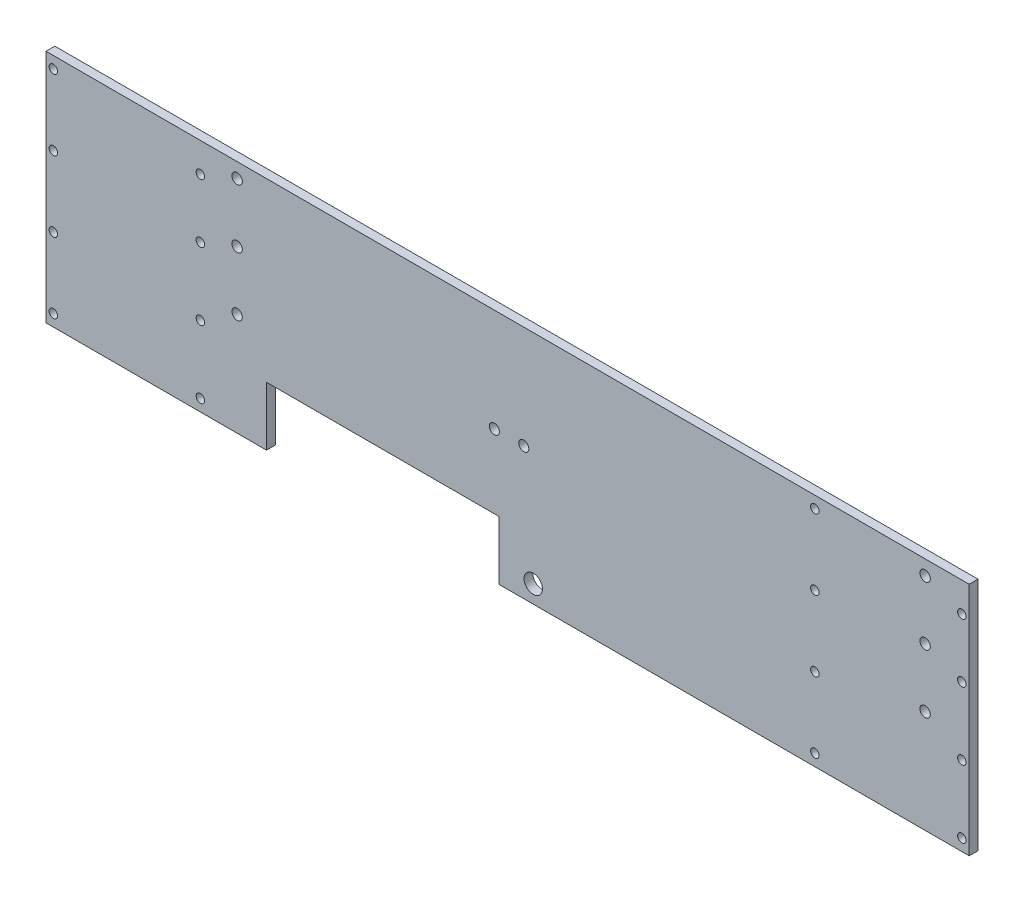
ISO-10303-21;
HEADER;
FILE_DESCRIPTION(('STEP AP214'),'2;1');
FILE_NAME('part.step','',(''),(''),'','','');
FILE_SCHEMA(('AUTOMOTIVE_DESIGN { 1 0 10303 214 1 1 1 1 }'));
ENDSEC;
DATA;
#1=APPLICATION_CONTEXT('core data for automotive mechanical design processes');
#2=APPLICATION_PROTOCOL_DEFINITION('international standard','automotive_design',2000,#1);
#3=PRODUCT_CONTEXT('',#1,'mechanical');
#4=PRODUCT('Part','Part','',(#3));
#5=PRODUCT_RELATED_PRODUCT_CATEGORY('part','',(#4));
#6=PRODUCT_DEFINITION_FORMATION('','',#4);
#7=PRODUCT_DEFINITION_CONTEXT('part definition',#1,'design');
#8=PRODUCT_DEFINITION('design','',#6,#7);
#9=PRODUCT_DEFINITION_SHAPE('','',#8);
#10=(LENGTH_UNIT() NAMED_UNIT(*) SI_UNIT(.MILLI.,.METRE.));
#11=(NAMED_UNIT(*) PLANE_ANGLE_UNIT() SI_UNIT($,.RADIAN.));
#12=(NAMED_UNIT(*) SI_UNIT($,.STERADIAN.) SOLID_ANGLE_UNIT());
#13=UNCERTAINTY_MEASURE_WITH_UNIT(LENGTH_MEASURE(1.E-05),#10,'distance_accuracy_value','');
#14=(GEOMETRIC_REPRESENTATION_CONTEXT(3) GLOBAL_UNCERTAINTY_ASSIGNED_CONTEXT((#13)) GLOBAL_UNIT_ASSIGNED_CONTEXT((#10,
#11,#12)) REPRESENTATION_CONTEXT('',''));
#15=CARTESIAN_POINT('',(0.,0.,0.));
#16=DIRECTION('',(0.,0.,1.));
#17=DIRECTION('',(1.,0.,0.));
#18=AXIS2_PLACEMENT_3D('',#15,#16,#17);
#19=CARTESIAN_POINT('',(-199.39,-50.8,3.81));
#20=DIRECTION('',(0.,1.,0.));
#21=DIRECTION('',(0.,0.,1.));
#22=AXIS2_PLACEMENT_3D('',#19,#20,#21);
#23=PLANE('',#22);
#24=DIRECTION('',(1.,0.,0.));
#25=VECTOR('',#24,1.);
#26=CARTESIAN_POINT('',(-199.39,-50.8,0.));
#27=LINE('',#26,#25);
#28=CARTESIAN_POINT('',(-199.39,-50.8,0.));
#29=VERTEX_POINT('',#28);
#30=CARTESIAN_POINT('',(-104.14,-50.8,0.));
#31=VERTEX_POINT('',#30);
#32=EDGE_CURVE('E129',#29,#31,#27,.T.);
#33=ORIENTED_EDGE('',*,*,#32,.T.);
#34=DIRECTION('',(0.,0.,1.));
#35=VECTOR('',#34,1.);
#36=CARTESIAN_POINT('',(-104.14,-50.8,0.));
#37=LINE('',#36,#35);
#38=CARTESIAN_POINT('',(-104.14,-50.8,3.81));
#39=VERTEX_POINT('',#38);
#40=EDGE_CURVE('E113',#31,#39,#37,.T.);
#41=ORIENTED_EDGE('',*,*,#40,.T.);
#42=DIRECTION('',(1.,0.,0.));
#43=VECTOR('',#42,1.);
#44=CARTESIAN_POINT('',(-199.39,-50.8,3.81));
#45=LINE('',#44,#43);
#46=CARTESIAN_POINT('',(-199.39,-50.8,3.81));
#47=VERTEX_POINT('',#46);
#48=EDGE_CURVE('E146',#47,#39,#45,.T.);
#49=ORIENTED_EDGE('',*,*,#48,.F.);
#50=DIRECTION('',(0.,0.,-1.));
#51=VECTOR('',#50,1.);
#52=CARTESIAN_POINT('',(-199.39,-50.8,3.81));
#53=LINE('',#52,#51);
#54=EDGE_CURVE('E136',#47,#29,#53,.T.);
#55=ORIENTED_EDGE('',*,*,#54,.T.);
#56=EDGE_LOOP('',(#33,#41,#49,#55));
#57=FACE_BOUND('',#56,.T.);
#58=ADVANCED_FACE('F37',(#57),#23,.F.);
#59=CARTESIAN_POINT('',(199.39,50.8,3.81));
#60=DIRECTION('',(-1.,0.,0.));
#61=DIRECTION('',(0.,0.,1.));
#62=AXIS2_PLACEMENT_3D('',#59,#60,#61);
#63=PLANE('',#62);
#64=DIRECTION('',(0.,1.,0.));
#65=VECTOR('',#64,1.);
#66=CARTESIAN_POINT('',(199.39,50.8,0.));
#67=LINE('',#66,#65);
#68=CARTESIAN_POINT('',(199.39,-50.8,0.));
#69=VERTEX_POINT('',#68);
#70=CARTESIAN_POINT('',(199.39,50.8,0.));
#71=VERTEX_POINT('',#70);
#72=EDGE_CURVE('E155',#69,#71,#67,.T.);
#73=ORIENTED_EDGE('',*,*,#72,.T.);
#74=DIRECTION('',(0.,0.,-1.));
#75=VECTOR('',#74,1.);
#76=CARTESIAN_POINT('',(199.39,50.8,3.81));
#77=LINE('',#76,#75);
#78=CARTESIAN_POINT('',(199.39,50.8,3.81));
#79=VERTEX_POINT('',#78);
#80=EDGE_CURVE('E11',#79,#71,#77,.T.);
#81=ORIENTED_EDGE('',*,*,#80,.F.);
#82=DIRECTION('',(0.,1.,0.));
#83=VECTOR('',#82,1.);
#84=CARTESIAN_POINT('',(199.39,50.8,3.81));
#85=LINE('',#84,#83);
#86=CARTESIAN_POINT('',(199.39,-50.8,3.81));
#87=VERTEX_POINT('',#86);
#88=EDGE_CURVE('E137',#87,#79,#85,.T.);
#89=ORIENTED_EDGE('',*,*,#88,.F.);
#90=DIRECTION('',(0.,0.,-1.));
#91=VECTOR('',#90,1.);
#92=CARTESIAN_POINT('',(199.39,-50.8,3.81));
#93=LINE('',#92,#91);
#94=EDGE_CURVE('E144',#87,#69,#93,.T.);
#95=ORIENTED_EDGE('',*,*,#94,.T.);
#96=EDGE_LOOP('',(#73,#81,#89,#95));
#97=FACE_BOUND('',#96,.T.);
#98=ADVANCED_FACE('F39',(#97),#63,.F.);
#99=CARTESIAN_POINT('',(-199.39,50.8,3.81));
#100=DIRECTION('',(0.,-1.,0.));
#101=DIRECTION('',(0.,0.,-1.));
#102=AXIS2_PLACEMENT_3D('',#99,#100,#101);
#103=PLANE('',#102);
#104=DIRECTION('',(-1.,0.,0.));
#105=VECTOR('',#104,1.);
#106=CARTESIAN_POINT('',(-199.39,50.8,0.));
#107=LINE('',#106,#105);
#108=CARTESIAN_POINT('',(-199.39,50.8,0.));
#109=VERTEX_POINT('',#108);
#110=EDGE_CURVE('E154',#71,#109,#107,.T.);
#111=ORIENTED_EDGE('',*,*,#110,.T.);
#112=DIRECTION('',(0.,0.,-1.));
#113=VECTOR('',#112,1.);
#114=CARTESIAN_POINT('',(-199.39,50.8,3.81));
#115=LINE('',#114,#113);
#116=CARTESIAN_POINT('',(-199.39,50.8,3.81));
#117=VERTEX_POINT('',#116);
#118=EDGE_CURVE('E46',#117,#109,#115,.T.);
#119=ORIENTED_EDGE('',*,*,#118,.F.);
#120=DIRECTION('',(-1.,0.,0.));
#121=VECTOR('',#120,1.);
#122=CARTESIAN_POINT('',(-199.39,50.8,3.81));
#123=LINE('',#122,#121);
#124=EDGE_CURVE('E91',#79,#117,#123,.T.);
#125=ORIENTED_EDGE('',*,*,#124,.F.);
#126=ORIENTED_EDGE('',*,*,#80,.T.);
#127=EDGE_LOOP('',(#111,#119,#125,#126));
#128=FACE_BOUND('',#127,.T.);
#129=ADVANCED_FACE('F344',(#128),#103,.F.);
#130=CARTESIAN_POINT('',(-199.39,50.8,3.81));
#131=DIRECTION('',(1.,0.,0.));
#132=DIRECTION('',(0.,0.,-1.));
#133=AXIS2_PLACEMENT_3D('',#130,#131,#132);
#134=PLANE('',#133);
#135=DIRECTION('',(0.,-1.,0.));
#136=VECTOR('',#135,1.);
#137=CARTESIAN_POINT('',(-199.39,50.8,0.));
#138=LINE('',#137,#136);
#139=EDGE_CURVE('E140',#109,#29,#138,.T.);
#140=ORIENTED_EDGE('',*,*,#139,.T.);
#141=ORIENTED_EDGE('',*,*,#54,.F.);
#142=DIRECTION('',(0.,-1.,0.));
#143=VECTOR('',#142,1.);
#144=CARTESIAN_POINT('',(-199.39,50.8,3.81));
#145=LINE('',#144,#143);
#146=EDGE_CURVE('E152',#117,#47,#145,.T.);
#147=ORIENTED_EDGE('',*,*,#146,.F.);
#148=ORIENTED_EDGE('',*,*,#118,.T.);
#149=EDGE_LOOP('',(#140,#141,#147,#148));
#150=FACE_BOUND('',#149,.T.);
#151=ADVANCED_FACE('F151',(#150),#134,.F.);
#152=CARTESIAN_POINT('',(-3.80999999999998,-50.8,3.81));
#153=VERTEX_POINT('',#152);
#154=EDGE_CURVE('E62',#153,#87,#45,.T.);
#155=ORIENTED_EDGE('',*,*,#154,.F.);
#156=DIRECTION('',(0.,0.,1.));
#157=VECTOR('',#156,1.);
#158=CARTESIAN_POINT('',(-3.80999999999998,-50.8,0.));
#159=LINE('',#158,#157);
#160=CARTESIAN_POINT('',(-3.80999999999998,-50.8,0.));
#161=VERTEX_POINT('',#160);
#162=EDGE_CURVE('E123',#161,#153,#159,.T.);
#163=ORIENTED_EDGE('',*,*,#162,.F.);
#164=EDGE_CURVE('E84',#161,#69,#27,.T.);
#165=ORIENTED_EDGE('',*,*,#164,.T.);
#166=ORIENTED_EDGE('',*,*,#94,.F.);
#167=EDGE_LOOP('',(#155,#163,#165,#166));
#168=FACE_BOUND('',#167,.T.);
#169=ADVANCED_FACE('F340',(#168),#23,.F.);
#170=CARTESIAN_POINT('',(0.,0.,3.81));
#171=DIRECTION('',(0.,0.,1.));
#172=DIRECTION('',(1.,0.,0.));
#173=AXIS2_PLACEMENT_3D('',#170,#171,#172);
#174=PLANE('',#173);
#175=CARTESIAN_POINT('',(-5.71499999999997,6.35,3.81));
#176=DIRECTION('',(0.,0.,1.));
#177=DIRECTION('',(1.,0.,0.));
#178=AXIS2_PLACEMENT_3D('',#175,#176,#177);
#179=CIRCLE('',#178,2.182876);
#180=CARTESIAN_POINT('',(-3.53212399999997,6.35,3.81));
#181=VERTEX_POINT('',#180);
#182=EDGE_CURVE('E319',#181,#181,#179,.T.);
#183=ORIENTED_EDGE('',*,*,#182,.F.);
#184=EDGE_LOOP('',(#183));
#185=FACE_BOUND('',#184,.T.);
#186=CARTESIAN_POINT('',(6.98500000000005,6.35000000000001,3.81));
#187=DIRECTION('',(0.,0.,1.));
#188=DIRECTION('',(1.,0.,0.));
#189=AXIS2_PLACEMENT_3D('',#186,#187,#188);
#190=CIRCLE('',#189,2.182876);
#191=CARTESIAN_POINT('',(9.16787600000005,6.35000000000001,3.81));
#192=VERTEX_POINT('',#191);
#193=EDGE_CURVE('E316',#192,#192,#190,.T.);
#194=ORIENTED_EDGE('',*,*,#193,.F.);
#195=EDGE_LOOP('',(#194));
#196=FACE_BOUND('',#195,.T.);
#197=CARTESIAN_POINT('',(-132.715,-16.51,3.81));
#198=DIRECTION('',(0.,0.,1.));
#199=DIRECTION('',(1.,0.,0.));
#200=AXIS2_PLACEMENT_3D('',#197,#198,#199);
#201=CIRCLE('',#200,1.82879999999999);
#202=CARTESIAN_POINT('',(-130.8862,-16.51,3.81));
#203=VERTEX_POINT('',#202);
#204=EDGE_CURVE('E307',#203,#203,#201,.T.);
#205=ORIENTED_EDGE('',*,*,#204,.F.);
#206=EDGE_LOOP('',(#205));
#207=FACE_BOUND('',#206,.T.);
#208=CARTESIAN_POINT('',(-132.715,12.7,3.81));
#209=DIRECTION('',(0.,0.,1.));
#210=DIRECTION('',(1.,0.,0.));
#211=AXIS2_PLACEMENT_3D('',#208,#209,#210);
#212=CIRCLE('',#211,1.82879999999999);
#213=CARTESIAN_POINT('',(-130.8862,12.7,3.81));
#214=VERTEX_POINT('',#213);
#215=EDGE_CURVE('E301',#214,#214,#212,.T.);
#216=ORIENTED_EDGE('',*,*,#215,.F.);
#217=EDGE_LOOP('',(#216));
#218=FACE_BOUND('',#217,.T.);
#219=CARTESIAN_POINT('',(-132.715,38.1,3.81));
#220=DIRECTION('',(0.,0.,1.));
#221=DIRECTION('',(1.,0.,0.));
#222=AXIS2_PLACEMENT_3D('',#219,#220,#221);
#223=CIRCLE('',#222,1.82879999999999);
#224=CARTESIAN_POINT('',(-130.8862,38.1,3.81));
#225=VERTEX_POINT('',#224);
#226=EDGE_CURVE('E295',#225,#225,#223,.T.);
#227=ORIENTED_EDGE('',*,*,#226,.F.);
#228=EDGE_LOOP('',(#227));
#229=FACE_BOUND('',#228,.T.);
#230=CARTESIAN_POINT('',(-196.215,45.72,3.81));
#231=DIRECTION('',(0.,0.,1.));
#232=DIRECTION('',(1.,0.,0.));
#233=AXIS2_PLACEMENT_3D('',#230,#231,#232);
#234=CIRCLE('',#233,1.82879999999999);
#235=CARTESIAN_POINT('',(-194.3862,45.72,3.81));
#236=VERTEX_POINT('',#235);
#237=EDGE_CURVE('E289',#236,#236,#234,.T.);
#238=ORIENTED_EDGE('',*,*,#237,.F.);
#239=EDGE_LOOP('',(#238));
#240=FACE_BOUND('',#239,.T.);
#241=CARTESIAN_POINT('',(-196.215,15.24,3.81));
#242=DIRECTION('',(0.,0.,1.));
#243=DIRECTION('',(1.,0.,0.));
#244=AXIS2_PLACEMENT_3D('',#241,#242,#243);
#245=CIRCLE('',#244,1.82879999999999);
#246=CARTESIAN_POINT('',(-194.3862,15.24,3.81));
#247=VERTEX_POINT('',#246);
#248=EDGE_CURVE('E283',#247,#247,#245,.T.);
#249=ORIENTED_EDGE('',*,*,#248,.F.);
#250=EDGE_LOOP('',(#249));
#251=FACE_BOUND('',#250,.T.);
#252=CARTESIAN_POINT('',(-196.215,-45.72,3.81));
#253=DIRECTION('',(0.,0.,1.));
#254=DIRECTION('',(1.,0.,0.));
#255=AXIS2_PLACEMENT_3D('',#252,#253,#254);
#256=CIRCLE('',#255,1.82879999999999);
#257=CARTESIAN_POINT('',(-194.3862,-45.72,3.81));
#258=VERTEX_POINT('',#257);
#259=EDGE_CURVE('E277',#258,#258,#256,.T.);
#260=ORIENTED_EDGE('',*,*,#259,.F.);
#261=EDGE_LOOP('',(#260));
#262=FACE_BOUND('',#261,.T.);
#263=CARTESIAN_POINT('',(-132.715,-45.72,3.81));
#264=DIRECTION('',(0.,0.,1.));
#265=DIRECTION('',(1.,0.,0.));
#266=AXIS2_PLACEMENT_3D('',#263,#264,#265);
#267=CIRCLE('',#266,1.82879999999999);
#268=CARTESIAN_POINT('',(-130.8862,-45.72,3.81));
#269=VERTEX_POINT('',#268);
#270=EDGE_CURVE('E271',#269,#269,#267,.T.);
#271=ORIENTED_EDGE('',*,*,#270,.F.);
#272=EDGE_LOOP('',(#271));
#273=FACE_BOUND('',#272,.T.);
#274=CARTESIAN_POINT('',(-196.215,-15.24,3.81));
#275=DIRECTION('',(0.,0.,1.));
#276=DIRECTION('',(1.,0.,0.));
#277=AXIS2_PLACEMENT_3D('',#274,#275,#276);
#278=CIRCLE('',#277,1.82879999999999);
#279=CARTESIAN_POINT('',(-194.3862,-15.24,3.81));
#280=VERTEX_POINT('',#279);
#281=EDGE_CURVE('E265',#280,#280,#278,.T.);
#282=ORIENTED_EDGE('',*,*,#281,.F.);
#283=EDGE_LOOP('',(#282));
#284=FACE_BOUND('',#283,.T.);
#285=CARTESIAN_POINT('',(180.34,44.45,3.81));
#286=DIRECTION('',(0.,0.,1.));
#287=DIRECTION('',(1.,0.,0.));
#288=AXIS2_PLACEMENT_3D('',#285,#286,#287);
#289=CIRCLE('',#288,2.2479);
#290=CARTESIAN_POINT('',(182.5879,44.45,3.81));
#291=VERTEX_POINT('',#290);
#292=EDGE_CURVE('E262',#291,#291,#289,.T.);
#293=ORIENTED_EDGE('',*,*,#292,.F.);
#294=EDGE_LOOP('',(#293));
#295=FACE_BOUND('',#294,.T.);
#296=CARTESIAN_POINT('',(180.34,19.05,3.81));
#297=DIRECTION('',(0.,0.,1.));
#298=DIRECTION('',(1.,0.,0.));
#299=AXIS2_PLACEMENT_3D('',#296,#297,#298);
#300=CIRCLE('',#299,2.2479);
#301=CARTESIAN_POINT('',(182.5879,19.05,3.81));
#302=VERTEX_POINT('',#301);
#303=EDGE_CURVE('E256',#302,#302,#300,.T.);
#304=ORIENTED_EDGE('',*,*,#303,.F.);
#305=EDGE_LOOP('',(#304));
#306=FACE_BOUND('',#305,.T.);
#307=CARTESIAN_POINT('',(180.34,-6.35,3.81));
#308=DIRECTION('',(0.,0.,1.));
#309=DIRECTION('',(1.,0.,0.));
#310=AXIS2_PLACEMENT_3D('',#307,#308,#309);
#311=CIRCLE('',#310,2.2479);
#312=CARTESIAN_POINT('',(182.5879,-6.35,3.81));
#313=VERTEX_POINT('',#312);
#314=EDGE_CURVE('E250',#313,#313,#311,.T.);
#315=ORIENTED_EDGE('',*,*,#314,.F.);
#316=EDGE_LOOP('',(#315));
#317=FACE_BOUND('',#316,.T.);
#318=CARTESIAN_POINT('',(-116.84,44.45,3.81));
#319=DIRECTION('',(0.,0.,1.));
#320=DIRECTION('',(1.,0.,0.));
#321=AXIS2_PLACEMENT_3D('',#318,#319,#320);
#322=CIRCLE('',#321,2.2479);
#323=CARTESIAN_POINT('',(-114.5921,44.45,3.81));
#324=VERTEX_POINT('',#323);
#325=EDGE_CURVE('E244',#324,#324,#322,.T.);
#326=ORIENTED_EDGE('',*,*,#325,.F.);
#327=EDGE_LOOP('',(#326));
#328=FACE_BOUND('',#327,.T.);
#329=CARTESIAN_POINT('',(-116.84,19.05,3.81));
#330=DIRECTION('',(0.,0.,1.));
#331=DIRECTION('',(1.,0.,0.));
#332=AXIS2_PLACEMENT_3D('',#329,#330,#331);
#333=CIRCLE('',#332,2.2479);
#334=CARTESIAN_POINT('',(-114.5921,19.05,3.81));
#335=VERTEX_POINT('',#334);
#336=EDGE_CURVE('E238',#335,#335,#333,.T.);
#337=ORIENTED_EDGE('',*,*,#336,.F.);
#338=EDGE_LOOP('',(#337));
#339=FACE_BOUND('',#338,.T.);
#340=CARTESIAN_POINT('',(-116.84,-6.35,3.81));
#341=DIRECTION('',(0.,0.,1.));
#342=DIRECTION('',(1.,0.,0.));
#343=AXIS2_PLACEMENT_3D('',#340,#341,#342);
#344=CIRCLE('',#343,2.2479);
#345=CARTESIAN_POINT('',(-114.5921,-6.35,3.81));
#346=VERTEX_POINT('',#345);
#347=EDGE_CURVE('E232',#346,#346,#344,.T.);
#348=ORIENTED_EDGE('',*,*,#347,.F.);
#349=EDGE_LOOP('',(#348));
#350=FACE_BOUND('',#349,.T.);
#351=CARTESIAN_POINT('',(132.715,-15.24,3.81));
#352=DIRECTION('',(0.,0.,1.));
#353=DIRECTION('',(1.,0.,0.));
#354=AXIS2_PLACEMENT_3D('',#351,#352,#353);
#355=CIRCLE('',#354,1.82879999999999);
#356=CARTESIAN_POINT('',(134.5438,-15.24,3.81));
#357=VERTEX_POINT('',#356);
#358=EDGE_CURVE('E226',#357,#357,#355,.T.);
#359=ORIENTED_EDGE('',*,*,#358,.F.);
#360=EDGE_LOOP('',(#359));
#361=FACE_BOUND('',#360,.T.);
#362=CARTESIAN_POINT('',(196.215,-16.51,3.81));
#363=DIRECTION('',(0.,0.,1.));
#364=DIRECTION('',(1.,0.,0.));
#365=AXIS2_PLACEMENT_3D('',#362,#363,#364);
#366=CIRCLE('',#365,1.82879999999999);
#367=CARTESIAN_POINT('',(198.0438,-16.51,3.81));
#368=VERTEX_POINT('',#367);
#369=EDGE_CURVE('E220',#368,#368,#366,.T.);
#370=ORIENTED_EDGE('',*,*,#369,.F.);
#371=EDGE_LOOP('',(#370));
#372=FACE_BOUND('',#371,.T.);
#373=CARTESIAN_POINT('',(196.215,12.7,3.81));
#374=DIRECTION('',(0.,0.,1.));
#375=DIRECTION('',(1.,0.,0.));
#376=AXIS2_PLACEMENT_3D('',#373,#374,#375);
#377=CIRCLE('',#376,1.82879999999999);
#378=CARTESIAN_POINT('',(198.0438,12.7,3.81));
#379=VERTEX_POINT('',#378);
#380=EDGE_CURVE('E214',#379,#379,#377,.T.);
#381=ORIENTED_EDGE('',*,*,#380,.F.);
#382=EDGE_LOOP('',(#381));
#383=FACE_BOUND('',#382,.T.);
#384=CARTESIAN_POINT('',(196.215,38.1,3.81));
#385=DIRECTION('',(0.,0.,1.));
#386=DIRECTION('',(1.,0.,0.));
#387=AXIS2_PLACEMENT_3D('',#384,#385,#386);
#388=CIRCLE('',#387,1.82879999999999);
#389=CARTESIAN_POINT('',(198.0438,38.1,3.81));
#390=VERTEX_POINT('',#389);
#391=EDGE_CURVE('E208',#390,#390,#388,.T.);
#392=ORIENTED_EDGE('',*,*,#391,.F.);
#393=EDGE_LOOP('',(#392));
#394=FACE_BOUND('',#393,.T.);
#395=CARTESIAN_POINT('',(132.715,45.72,3.81));
#396=DIRECTION('',(0.,0.,1.));
#397=DIRECTION('',(1.,0.,0.));
#398=AXIS2_PLACEMENT_3D('',#395,#396,#397);
#399=CIRCLE('',#398,1.82879999999999);
#400=CARTESIAN_POINT('',(134.5438,45.72,3.81));
#401=VERTEX_POINT('',#400);
#402=EDGE_CURVE('E202',#401,#401,#399,.T.);
#403=ORIENTED_EDGE('',*,*,#402,.F.);
#404=EDGE_LOOP('',(#403));
#405=FACE_BOUND('',#404,.T.);
#406=CARTESIAN_POINT('',(132.715,15.24,3.81));
#407=DIRECTION('',(0.,0.,1.));
#408=DIRECTION('',(1.,0.,0.));
#409=AXIS2_PLACEMENT_3D('',#406,#407,#408);
#410=CIRCLE('',#409,1.82879999999999);
#411=CARTESIAN_POINT('',(134.5438,15.24,3.81));
#412=VERTEX_POINT('',#411);
#413=EDGE_CURVE('E196',#412,#412,#410,.T.);
#414=ORIENTED_EDGE('',*,*,#413,.F.);
#415=EDGE_LOOP('',(#414));
#416=FACE_BOUND('',#415,.T.);
#417=CARTESIAN_POINT('',(132.715,-45.72,3.81));
#418=DIRECTION('',(0.,0.,1.));
#419=DIRECTION('',(1.,0.,0.));
#420=AXIS2_PLACEMENT_3D('',#417,#418,#419);
#421=CIRCLE('',#420,1.82879999999999);
#422=CARTESIAN_POINT('',(134.5438,-45.72,3.81));
#423=VERTEX_POINT('',#422);
#424=EDGE_CURVE('E190',#423,#423,#421,.T.);
#425=ORIENTED_EDGE('',*,*,#424,.F.);
#426=EDGE_LOOP('',(#425));
#427=FACE_BOUND('',#426,.T.);
#428=CARTESIAN_POINT('',(196.215,-45.72,3.81));
#429=DIRECTION('',(0.,0.,1.));
#430=DIRECTION('',(1.,0.,0.));
#431=AXIS2_PLACEMENT_3D('',#428,#429,#430);
#432=CIRCLE('',#431,1.82879999999999);
#433=CARTESIAN_POINT('',(198.0438,-45.72,3.81));
#434=VERTEX_POINT('',#433);
#435=EDGE_CURVE('E184',#434,#434,#432,.T.);
#436=ORIENTED_EDGE('',*,*,#435,.F.);
#437=EDGE_LOOP('',(#436));
#438=FACE_BOUND('',#437,.T.);
#439=CARTESIAN_POINT('',(11.074908,-43.18,3.81));
#440=DIRECTION('',(0.,0.,1.));
#441=DIRECTION('',(1.,0.,0.));
#442=AXIS2_PLACEMENT_3D('',#439,#440,#441);
#443=CIRCLE('',#442,3.96875);
#444=CARTESIAN_POINT('',(15.043658,-43.18,3.81));
#445=VERTEX_POINT('',#444);
#446=EDGE_CURVE('E178',#445,#445,#443,.T.);
#447=ORIENTED_EDGE('',*,*,#446,.F.);
#448=EDGE_LOOP('',(#447));
#449=FACE_BOUND('',#448,.T.);
#450=DIRECTION('',(0.,-1.,0.));
#451=VECTOR('',#450,1.);
#452=CARTESIAN_POINT('',(-104.14,-50.8,3.81));
#453=LINE('',#452,#451);
#454=CARTESIAN_POINT('',(-104.14,-25.4,3.81));
#455=VERTEX_POINT('',#454);
#456=EDGE_CURVE('E118',#455,#39,#453,.T.);
#457=ORIENTED_EDGE('',*,*,#456,.F.);
#458=DIRECTION('',(-1.,0.,0.));
#459=VECTOR('',#458,1.);
#460=CARTESIAN_POINT('',(-104.14,-25.4,3.81));
#461=LINE('',#460,#459);
#462=CARTESIAN_POINT('',(-3.80999999999998,-25.4,3.81));
#463=VERTEX_POINT('',#462);
#464=EDGE_CURVE('E132',#463,#455,#461,.T.);
#465=ORIENTED_EDGE('',*,*,#464,.F.);
#466=DIRECTION('',(0.,1.,0.));
#467=VECTOR('',#466,1.);
#468=CARTESIAN_POINT('',(-3.80999999999998,-50.8,3.81));
#469=LINE('',#468,#467);
#470=EDGE_CURVE('E169',#153,#463,#469,.T.);
#471=ORIENTED_EDGE('',*,*,#470,.F.);
#472=ORIENTED_EDGE('',*,*,#154,.T.);
#473=ORIENTED_EDGE('',*,*,#88,.T.);
#474=ORIENTED_EDGE('',*,*,#124,.T.);
#475=ORIENTED_EDGE('',*,*,#146,.T.);
#476=ORIENTED_EDGE('',*,*,#48,.T.);
#477=EDGE_LOOP('',(#457,#465,#471,#472,#473,#474,#475,#476));
#478=FACE_BOUND('',#477,.T.);
#479=ADVANCED_FACE('F349',(#185,#196,#207,#218,#229,#240,#251,#262,#273,#284,#295,#306,#317,
#328,#339,#350,#361,#372,#383,#394,#405,#416,#427,#438,#449,#478),#174,.T.);
#480=CARTESIAN_POINT('',(0.,0.,0.));
#481=DIRECTION('',(0.,0.,1.));
#482=DIRECTION('',(1.,0.,0.));
#483=AXIS2_PLACEMENT_3D('',#480,#481,#482);
#484=PLANE('',#483);
#485=CARTESIAN_POINT('',(-5.71499999999997,6.35,0.));
#486=DIRECTION('',(0.,0.,1.));
#487=DIRECTION('',(1.,0.,0.));
#488=AXIS2_PLACEMENT_3D('',#485,#486,#487);
#489=CIRCLE('',#488,2.182876);
#490=CARTESIAN_POINT('',(-3.53212399999997,6.35,0.));
#491=VERTEX_POINT('',#490);
#492=EDGE_CURVE('E41',#491,#491,#489,.T.);
#493=ORIENTED_EDGE('',*,*,#492,.T.);
#494=EDGE_LOOP('',(#493));
#495=FACE_BOUND('',#494,.T.);
#496=CARTESIAN_POINT('',(6.98500000000005,6.35000000000001,0.));
#497=DIRECTION('',(0.,0.,1.));
#498=DIRECTION('',(1.,0.,0.));
#499=AXIS2_PLACEMENT_3D('',#496,#497,#498);
#500=CIRCLE('',#499,2.182876);
#501=CARTESIAN_POINT('',(9.16787600000004,6.35000000000001,0.));
#502=VERTEX_POINT('',#501);
#503=EDGE_CURVE('E313',#502,#502,#500,.T.);
#504=ORIENTED_EDGE('',*,*,#503,.T.);
#505=EDGE_LOOP('',(#504));
#506=FACE_BOUND('',#505,.T.);
#507=CARTESIAN_POINT('',(-132.715,-16.51,0.));
#508=DIRECTION('',(0.,0.,1.));
#509=DIRECTION('',(1.,0.,0.));
#510=AXIS2_PLACEMENT_3D('',#507,#508,#509);
#511=CIRCLE('',#510,1.82879999999999);
#512=CARTESIAN_POINT('',(-130.8862,-16.51,0.));
#513=VERTEX_POINT('',#512);
#514=EDGE_CURVE('E310',#513,#513,#511,.T.);
#515=ORIENTED_EDGE('',*,*,#514,.T.);
#516=EDGE_LOOP('',(#515));
#517=FACE_BOUND('',#516,.T.);
#518=CARTESIAN_POINT('',(-132.715,12.7,0.));
#519=DIRECTION('',(0.,0.,1.));
#520=DIRECTION('',(1.,0.,0.));
#521=AXIS2_PLACEMENT_3D('',#518,#519,#520);
#522=CIRCLE('',#521,1.82879999999999);
#523=CARTESIAN_POINT('',(-130.8862,12.7,0.));
#524=VERTEX_POINT('',#523);
#525=EDGE_CURVE('E304',#524,#524,#522,.T.);
#526=ORIENTED_EDGE('',*,*,#525,.T.);
#527=EDGE_LOOP('',(#526));
#528=FACE_BOUND('',#527,.T.);
#529=CARTESIAN_POINT('',(-132.715,38.1,0.));
#530=DIRECTION('',(0.,0.,1.));
#531=DIRECTION('',(1.,0.,0.));
#532=AXIS2_PLACEMENT_3D('',#529,#530,#531);
#533=CIRCLE('',#532,1.82879999999999);
#534=CARTESIAN_POINT('',(-130.8862,38.1,0.));
#535=VERTEX_POINT('',#534);
#536=EDGE_CURVE('E298',#535,#535,#533,.T.);
#537=ORIENTED_EDGE('',*,*,#536,.T.);
#538=EDGE_LOOP('',(#537));
#539=FACE_BOUND('',#538,.T.);
#540=CARTESIAN_POINT('',(-196.215,45.72,0.));
#541=DIRECTION('',(0.,0.,1.));
#542=DIRECTION('',(1.,0.,0.));
#543=AXIS2_PLACEMENT_3D('',#540,#541,#542);
#544=CIRCLE('',#543,1.82879999999999);
#545=CARTESIAN_POINT('',(-194.3862,45.72,0.));
#546=VERTEX_POINT('',#545);
#547=EDGE_CURVE('E292',#546,#546,#544,.T.);
#548=ORIENTED_EDGE('',*,*,#547,.T.);
#549=EDGE_LOOP('',(#548));
#550=FACE_BOUND('',#549,.T.);
#551=CARTESIAN_POINT('',(-196.215,15.24,0.));
#552=DIRECTION('',(0.,0.,1.));
#553=DIRECTION('',(1.,0.,0.));
#554=AXIS2_PLACEMENT_3D('',#551,#552,#553);
#555=CIRCLE('',#554,1.82879999999999);
#556=CARTESIAN_POINT('',(-194.3862,15.24,0.));
#557=VERTEX_POINT('',#556);
#558=EDGE_CURVE('E286',#557,#557,#555,.T.);
#559=ORIENTED_EDGE('',*,*,#558,.T.);
#560=EDGE_LOOP('',(#559));
#561=FACE_BOUND('',#560,.T.);
#562=CARTESIAN_POINT('',(-196.215,-45.72,0.));
#563=DIRECTION('',(0.,0.,1.));
#564=DIRECTION('',(1.,0.,0.));
#565=AXIS2_PLACEMENT_3D('',#562,#563,#564);
#566=CIRCLE('',#565,1.82879999999999);
#567=CARTESIAN_POINT('',(-194.3862,-45.72,0.));
#568=VERTEX_POINT('',#567);
#569=EDGE_CURVE('E280',#568,#568,#566,.T.);
#570=ORIENTED_EDGE('',*,*,#569,.T.);
#571=EDGE_LOOP('',(#570));
#572=FACE_BOUND('',#571,.T.);
#573=CARTESIAN_POINT('',(-132.715,-45.72,0.));
#574=DIRECTION('',(0.,0.,1.));
#575=DIRECTION('',(1.,0.,0.));
#576=AXIS2_PLACEMENT_3D('',#573,#574,#575);
#577=CIRCLE('',#576,1.82879999999999);
#578=CARTESIAN_POINT('',(-130.8862,-45.72,0.));
#579=VERTEX_POINT('',#578);
#580=EDGE_CURVE('E274',#579,#579,#577,.T.);
#581=ORIENTED_EDGE('',*,*,#580,.T.);
#582=EDGE_LOOP('',(#581));
#583=FACE_BOUND('',#582,.T.);
#584=CARTESIAN_POINT('',(-196.215,-15.24,0.));
#585=DIRECTION('',(0.,0.,1.));
#586=DIRECTION('',(1.,0.,0.));
#587=AXIS2_PLACEMENT_3D('',#584,#585,#586);
#588=CIRCLE('',#587,1.82879999999999);
#589=CARTESIAN_POINT('',(-194.3862,-15.24,0.));
#590=VERTEX_POINT('',#589);
#591=EDGE_CURVE('E268',#590,#590,#588,.T.);
#592=ORIENTED_EDGE('',*,*,#591,.T.);
#593=EDGE_LOOP('',(#592));
#594=FACE_BOUND('',#593,.T.);
#595=CARTESIAN_POINT('',(180.34,44.45,0.));
#596=DIRECTION('',(0.,0.,1.));
#597=DIRECTION('',(1.,0.,0.));
#598=AXIS2_PLACEMENT_3D('',#595,#596,#597);
#599=CIRCLE('',#598,2.2479);
#600=CARTESIAN_POINT('',(182.5879,44.45,0.));
#601=VERTEX_POINT('',#600);
#602=EDGE_CURVE('E259',#601,#601,#599,.T.);
#603=ORIENTED_EDGE('',*,*,#602,.T.);
#604=EDGE_LOOP('',(#603));
#605=FACE_BOUND('',#604,.T.);
#606=CARTESIAN_POINT('',(180.34,19.05,0.));
#607=DIRECTION('',(0.,0.,1.));
#608=DIRECTION('',(1.,0.,0.));
#609=AXIS2_PLACEMENT_3D('',#606,#607,#608);
#610=CIRCLE('',#609,2.2479);
#611=CARTESIAN_POINT('',(182.5879,19.05,0.));
#612=VERTEX_POINT('',#611);
#613=EDGE_CURVE('E253',#612,#612,#610,.T.);
#614=ORIENTED_EDGE('',*,*,#613,.T.);
#615=EDGE_LOOP('',(#614));
#616=FACE_BOUND('',#615,.T.);
#617=CARTESIAN_POINT('',(180.34,-6.35,0.));
#618=DIRECTION('',(0.,0.,1.));
#619=DIRECTION('',(1.,0.,0.));
#620=AXIS2_PLACEMENT_3D('',#617,#618,#619);
#621=CIRCLE('',#620,2.2479);
#622=CARTESIAN_POINT('',(182.5879,-6.35,0.));
#623=VERTEX_POINT('',#622);
#624=EDGE_CURVE('E247',#623,#623,#621,.T.);
#625=ORIENTED_EDGE('',*,*,#624,.T.);
#626=EDGE_LOOP('',(#625));
#627=FACE_BOUND('',#626,.T.);
#628=CARTESIAN_POINT('',(-116.84,44.45,0.));
#629=DIRECTION('',(0.,0.,1.));
#630=DIRECTION('',(1.,0.,0.));
#631=AXIS2_PLACEMENT_3D('',#628,#629,#630);
#632=CIRCLE('',#631,2.2479);
#633=CARTESIAN_POINT('',(-114.5921,44.45,0.));
#634=VERTEX_POINT('',#633);
#635=EDGE_CURVE('E241',#634,#634,#632,.T.);
#636=ORIENTED_EDGE('',*,*,#635,.T.);
#637=EDGE_LOOP('',(#636));
#638=FACE_BOUND('',#637,.T.);
#639=CARTESIAN_POINT('',(-116.84,19.05,0.));
#640=DIRECTION('',(0.,0.,1.));
#641=DIRECTION('',(1.,0.,0.));
#642=AXIS2_PLACEMENT_3D('',#639,#640,#641);
#643=CIRCLE('',#642,2.2479);
#644=CARTESIAN_POINT('',(-114.5921,19.05,0.));
#645=VERTEX_POINT('',#644);
#646=EDGE_CURVE('E235',#645,#645,#643,.T.);
#647=ORIENTED_EDGE('',*,*,#646,.T.);
#648=EDGE_LOOP('',(#647));
#649=FACE_BOUND('',#648,.T.);
#650=CARTESIAN_POINT('',(-116.84,-6.35,0.));
#651=DIRECTION('',(0.,0.,1.));
#652=DIRECTION('',(1.,0.,0.));
#653=AXIS2_PLACEMENT_3D('',#650,#651,#652);
#654=CIRCLE('',#653,2.2479);
#655=CARTESIAN_POINT('',(-114.5921,-6.35,0.));
#656=VERTEX_POINT('',#655);
#657=EDGE_CURVE('E229',#656,#656,#654,.T.);
#658=ORIENTED_EDGE('',*,*,#657,.T.);
#659=EDGE_LOOP('',(#658));
#660=FACE_BOUND('',#659,.T.);
#661=CARTESIAN_POINT('',(132.715,-15.24,0.));
#662=DIRECTION('',(0.,0.,1.));
#663=DIRECTION('',(1.,0.,0.));
#664=AXIS2_PLACEMENT_3D('',#661,#662,#663);
#665=CIRCLE('',#664,1.82879999999999);
#666=CARTESIAN_POINT('',(134.5438,-15.24,0.));
#667=VERTEX_POINT('',#666);
#668=EDGE_CURVE('E223',#667,#667,#665,.T.);
#669=ORIENTED_EDGE('',*,*,#668,.T.);
#670=EDGE_LOOP('',(#669));
#671=FACE_BOUND('',#670,.T.);
#672=CARTESIAN_POINT('',(196.215,-16.51,0.));
#673=DIRECTION('',(0.,0.,1.));
#674=DIRECTION('',(1.,0.,0.));
#675=AXIS2_PLACEMENT_3D('',#672,#673,#674);
#676=CIRCLE('',#675,1.82879999999999);
#677=CARTESIAN_POINT('',(198.0438,-16.51,0.));
#678=VERTEX_POINT('',#677);
#679=EDGE_CURVE('E217',#678,#678,#676,.T.);
#680=ORIENTED_EDGE('',*,*,#679,.T.);
#681=EDGE_LOOP('',(#680));
#682=FACE_BOUND('',#681,.T.);
#683=CARTESIAN_POINT('',(196.215,12.7,0.));
#684=DIRECTION('',(0.,0.,1.));
#685=DIRECTION('',(1.,0.,0.));
#686=AXIS2_PLACEMENT_3D('',#683,#684,#685);
#687=CIRCLE('',#686,1.82879999999999);
#688=CARTESIAN_POINT('',(198.0438,12.7,0.));
#689=VERTEX_POINT('',#688);
#690=EDGE_CURVE('E211',#689,#689,#687,.T.);
#691=ORIENTED_EDGE('',*,*,#690,.T.);
#692=EDGE_LOOP('',(#691));
#693=FACE_BOUND('',#692,.T.);
#694=CARTESIAN_POINT('',(196.215,38.1,0.));
#695=DIRECTION('',(0.,0.,1.));
#696=DIRECTION('',(1.,0.,0.));
#697=AXIS2_PLACEMENT_3D('',#694,#695,#696);
#698=CIRCLE('',#697,1.82879999999999);
#699=CARTESIAN_POINT('',(198.0438,38.1,0.));
#700=VERTEX_POINT('',#699);
#701=EDGE_CURVE('E205',#700,#700,#698,.T.);
#702=ORIENTED_EDGE('',*,*,#701,.T.);
#703=EDGE_LOOP('',(#702));
#704=FACE_BOUND('',#703,.T.);
#705=CARTESIAN_POINT('',(132.715,45.72,0.));
#706=DIRECTION('',(0.,0.,1.));
#707=DIRECTION('',(1.,0.,0.));
#708=AXIS2_PLACEMENT_3D('',#705,#706,#707);
#709=CIRCLE('',#708,1.82879999999999);
#710=CARTESIAN_POINT('',(134.5438,45.72,0.));
#711=VERTEX_POINT('',#710);
#712=EDGE_CURVE('E199',#711,#711,#709,.T.);
#713=ORIENTED_EDGE('',*,*,#712,.T.);
#714=EDGE_LOOP('',(#713));
#715=FACE_BOUND('',#714,.T.);
#716=CARTESIAN_POINT('',(132.715,15.24,0.));
#717=DIRECTION('',(0.,0.,1.));
#718=DIRECTION('',(1.,0.,0.));
#719=AXIS2_PLACEMENT_3D('',#716,#717,#718);
#720=CIRCLE('',#719,1.82879999999999);
#721=CARTESIAN_POINT('',(134.5438,15.24,0.));
#722=VERTEX_POINT('',#721);
#723=EDGE_CURVE('E193',#722,#722,#720,.T.);
#724=ORIENTED_EDGE('',*,*,#723,.T.);
#725=EDGE_LOOP('',(#724));
#726=FACE_BOUND('',#725,.T.);
#727=CARTESIAN_POINT('',(132.715,-45.72,0.));
#728=DIRECTION('',(0.,0.,1.));
#729=DIRECTION('',(1.,0.,0.));
#730=AXIS2_PLACEMENT_3D('',#727,#728,#729);
#731=CIRCLE('',#730,1.82879999999999);
#732=CARTESIAN_POINT('',(134.5438,-45.72,0.));
#733=VERTEX_POINT('',#732);
#734=EDGE_CURVE('E187',#733,#733,#731,.T.);
#735=ORIENTED_EDGE('',*,*,#734,.T.);
#736=EDGE_LOOP('',(#735));
#737=FACE_BOUND('',#736,.T.);
#738=CARTESIAN_POINT('',(196.215,-45.72,0.));
#739=DIRECTION('',(0.,0.,1.));
#740=DIRECTION('',(1.,0.,0.));
#741=AXIS2_PLACEMENT_3D('',#738,#739,#740);
#742=CIRCLE('',#741,1.82879999999999);
#743=CARTESIAN_POINT('',(198.0438,-45.72,0.));
#744=VERTEX_POINT('',#743);
#745=EDGE_CURVE('E181',#744,#744,#742,.T.);
#746=ORIENTED_EDGE('',*,*,#745,.T.);
#747=EDGE_LOOP('',(#746));
#748=FACE_BOUND('',#747,.T.);
#749=CARTESIAN_POINT('',(11.074908,-43.18,0.));
#750=DIRECTION('',(0.,0.,1.));
#751=DIRECTION('',(1.,0.,0.));
#752=AXIS2_PLACEMENT_3D('',#749,#750,#751);
#753=CIRCLE('',#752,3.96875);
#754=CARTESIAN_POINT('',(15.043658,-43.18,0.));
#755=VERTEX_POINT('',#754);
#756=EDGE_CURVE('E173',#755,#755,#753,.T.);
#757=ORIENTED_EDGE('',*,*,#756,.T.);
#758=EDGE_LOOP('',(#757));
#759=FACE_BOUND('',#758,.T.);
#760=DIRECTION('',(-1.,0.,0.));
#761=VECTOR('',#760,1.);
#762=CARTESIAN_POINT('',(-104.14,-25.4,0.));
#763=LINE('',#762,#761);
#764=CARTESIAN_POINT('',(-3.80999999999998,-25.4,0.));
#765=VERTEX_POINT('',#764);
#766=CARTESIAN_POINT('',(-104.14,-25.4,0.));
#767=VERTEX_POINT('',#766);
#768=EDGE_CURVE('E53',#765,#767,#763,.T.);
#769=ORIENTED_EDGE('',*,*,#768,.T.);
#770=DIRECTION('',(0.,-1.,0.));
#771=VECTOR('',#770,1.);
#772=CARTESIAN_POINT('',(-104.14,-50.8,0.));
#773=LINE('',#772,#771);
#774=EDGE_CURVE('E116',#767,#31,#773,.T.);
#775=ORIENTED_EDGE('',*,*,#774,.T.);
#776=ORIENTED_EDGE('',*,*,#32,.F.);
#777=ORIENTED_EDGE('',*,*,#139,.F.);
#778=ORIENTED_EDGE('',*,*,#110,.F.);
#779=ORIENTED_EDGE('',*,*,#72,.F.);
#780=ORIENTED_EDGE('',*,*,#164,.F.);
#781=DIRECTION('',(0.,1.,0.));
#782=VECTOR('',#781,1.);
#783=CARTESIAN_POINT('',(-3.80999999999998,-50.8,0.));
#784=LINE('',#783,#782);
#785=EDGE_CURVE('E131',#161,#765,#784,.T.);
#786=ORIENTED_EDGE('',*,*,#785,.T.);
#787=EDGE_LOOP('',(#769,#775,#776,#777,#778,#779,#780,#786));
#788=FACE_BOUND('',#787,.T.);
#789=ADVANCED_FACE('F127',(#495,#506,#517,#528,#539,#550,#561,#572,#583,#594,#605,#616,#627,
#638,#649,#660,#671,#682,#693,#704,#715,#726,#737,#748,#759,#788),#484,.F.);
#790=CARTESIAN_POINT('',(-104.14,-50.8,0.));
#791=DIRECTION('',(-1.,0.,0.));
#792=DIRECTION('',(0.,0.,1.));
#793=AXIS2_PLACEMENT_3D('',#790,#791,#792);
#794=PLANE('',#793);
#795=ORIENTED_EDGE('',*,*,#456,.T.);
#796=ORIENTED_EDGE('',*,*,#40,.F.);
#797=ORIENTED_EDGE('',*,*,#774,.F.);
#798=DIRECTION('',(0.,0.,1.));
#799=VECTOR('',#798,1.);
#800=CARTESIAN_POINT('',(-104.14,-25.4,0.));
#801=LINE('',#800,#799);
#802=EDGE_CURVE('E157',#767,#455,#801,.T.);
#803=ORIENTED_EDGE('',*,*,#802,.T.);
#804=EDGE_LOOP('',(#795,#796,#797,#803));
#805=FACE_BOUND('',#804,.T.);
#806=ADVANCED_FACE('F115',(#805),#794,.F.);
#807=CARTESIAN_POINT('',(-104.14,-25.4,0.));
#808=DIRECTION('',(0.,1.,0.));
#809=DIRECTION('',(0.,0.,1.));
#810=AXIS2_PLACEMENT_3D('',#807,#808,#809);
#811=PLANE('',#810);
#812=ORIENTED_EDGE('',*,*,#464,.T.);
#813=ORIENTED_EDGE('',*,*,#802,.F.);
#814=ORIENTED_EDGE('',*,*,#768,.F.);
#815=DIRECTION('',(0.,0.,1.));
#816=VECTOR('',#815,1.);
#817=CARTESIAN_POINT('',(-3.80999999999998,-25.4,0.));
#818=LINE('',#817,#816);
#819=EDGE_CURVE('E164',#765,#463,#818,.T.);
#820=ORIENTED_EDGE('',*,*,#819,.T.);
#821=EDGE_LOOP('',(#812,#813,#814,#820));
#822=FACE_BOUND('',#821,.T.);
#823=ADVANCED_FACE('F359',(#822),#811,.F.);
#824=CARTESIAN_POINT('',(-3.80999999999998,-50.8,0.));
#825=DIRECTION('',(1.,0.,0.));
#826=DIRECTION('',(0.,0.,-1.));
#827=AXIS2_PLACEMENT_3D('',#824,#825,#826);
#828=PLANE('',#827);
#829=ORIENTED_EDGE('',*,*,#470,.T.);
#830=ORIENTED_EDGE('',*,*,#819,.F.);
#831=ORIENTED_EDGE('',*,*,#785,.F.);
#832=ORIENTED_EDGE('',*,*,#162,.T.);
#833=EDGE_LOOP('',(#829,#830,#831,#832));
#834=FACE_BOUND('',#833,.T.);
#835=ADVANCED_FACE('F361',(#834),#828,.F.);
#836=CARTESIAN_POINT('',(11.074908,-43.18,3.81));
#837=DIRECTION('',(0.,0.,1.));
#838=DIRECTION('',(1.,0.,0.));
#839=AXIS2_PLACEMENT_3D('',#836,#837,#838);
#840=CYLINDRICAL_SURFACE('',#839,3.96875);
#841=ORIENTED_EDGE('',*,*,#756,.F.);
#842=EDGE_LOOP('',(#841));
#843=FACE_BOUND('',#842,.T.);
#844=ORIENTED_EDGE('',*,*,#446,.T.);
#845=EDGE_LOOP('',(#844));
#846=FACE_BOUND('',#845,.T.);
#847=ADVANCED_FACE('F363',(#843,#846),#840,.F.);
#848=CARTESIAN_POINT('',(196.215,-45.72,3.81));
#849=DIRECTION('',(0.,0.,1.));
#850=DIRECTION('',(1.,0.,0.));
#851=AXIS2_PLACEMENT_3D('',#848,#849,#850);
#852=CYLINDRICAL_SURFACE('',#851,1.82879999999999);
#853=ORIENTED_EDGE('',*,*,#745,.F.);
#854=EDGE_LOOP('',(#853));
#855=FACE_BOUND('',#854,.T.);
#856=ORIENTED_EDGE('',*,*,#435,.T.);
#857=EDGE_LOOP('',(#856));
#858=FACE_BOUND('',#857,.T.);
#859=ADVANCED_FACE('F369',(#855,#858),#852,.F.);
#860=CARTESIAN_POINT('',(132.715,-45.72,3.81));
#861=DIRECTION('',(0.,0.,1.));
#862=DIRECTION('',(1.,0.,0.));
#863=AXIS2_PLACEMENT_3D('',#860,#861,#862);
#864=CYLINDRICAL_SURFACE('',#863,1.82879999999999);
#865=ORIENTED_EDGE('',*,*,#734,.F.);
#866=EDGE_LOOP('',(#865));
#867=FACE_BOUND('',#866,.T.);
#868=ORIENTED_EDGE('',*,*,#424,.T.);
#869=EDGE_LOOP('',(#868));
#870=FACE_BOUND('',#869,.T.);
#871=ADVANCED_FACE('F411',(#867,#870),#864,.F.);
#872=CARTESIAN_POINT('',(132.715,15.24,3.81));
#873=DIRECTION('',(0.,0.,1.));
#874=DIRECTION('',(1.,0.,0.));
#875=AXIS2_PLACEMENT_3D('',#872,#873,#874);
#876=CYLINDRICAL_SURFACE('',#875,1.82879999999999);
#877=ORIENTED_EDGE('',*,*,#723,.F.);
#878=EDGE_LOOP('',(#877));
#879=FACE_BOUND('',#878,.T.);
#880=ORIENTED_EDGE('',*,*,#413,.T.);
#881=EDGE_LOOP('',(#880));
#882=FACE_BOUND('',#881,.T.);
#883=ADVANCED_FACE('F422',(#879,#882),#876,.F.);
#884=CARTESIAN_POINT('',(132.715,45.72,3.81));
#885=DIRECTION('',(0.,0.,1.));
#886=DIRECTION('',(1.,0.,0.));
#887=AXIS2_PLACEMENT_3D('',#884,#885,#886);
#888=CYLINDRICAL_SURFACE('',#887,1.82879999999999);
#889=ORIENTED_EDGE('',*,*,#712,.F.);
#890=EDGE_LOOP('',(#889));
#891=FACE_BOUND('',#890,.T.);
#892=ORIENTED_EDGE('',*,*,#402,.T.);
#893=EDGE_LOOP('',(#892));
#894=FACE_BOUND('',#893,.T.);
#895=ADVANCED_FACE('F433',(#891,#894),#888,.F.);
#896=CARTESIAN_POINT('',(196.215,38.1,3.81));
#897=DIRECTION('',(0.,0.,1.));
#898=DIRECTION('',(1.,0.,0.));
#899=AXIS2_PLACEMENT_3D('',#896,#897,#898);
#900=CYLINDRICAL_SURFACE('',#899,1.82879999999999);
#901=ORIENTED_EDGE('',*,*,#701,.F.);
#902=EDGE_LOOP('',(#901));
#903=FACE_BOUND('',#902,.T.);
#904=ORIENTED_EDGE('',*,*,#391,.T.);
#905=EDGE_LOOP('',(#904));
#906=FACE_BOUND('',#905,.T.);
#907=ADVANCED_FACE('F444',(#903,#906),#900,.F.);
#908=CARTESIAN_POINT('',(196.215,12.7,3.81));
#909=DIRECTION('',(0.,0.,1.));
#910=DIRECTION('',(1.,0.,0.));
#911=AXIS2_PLACEMENT_3D('',#908,#909,#910);
#912=CYLINDRICAL_SURFACE('',#911,1.82879999999999);
#913=ORIENTED_EDGE('',*,*,#690,.F.);
#914=EDGE_LOOP('',(#913));
#915=FACE_BOUND('',#914,.T.);
#916=ORIENTED_EDGE('',*,*,#380,.T.);
#917=EDGE_LOOP('',(#916));
#918=FACE_BOUND('',#917,.T.);
#919=ADVANCED_FACE('F455',(#915,#918),#912,.F.);
#920=CARTESIAN_POINT('',(196.215,-16.51,3.81));
#921=DIRECTION('',(0.,0.,1.));
#922=DIRECTION('',(1.,0.,0.));
#923=AXIS2_PLACEMENT_3D('',#920,#921,#922);
#924=CYLINDRICAL_SURFACE('',#923,1.82879999999999);
#925=ORIENTED_EDGE('',*,*,#679,.F.);
#926=EDGE_LOOP('',(#925));
#927=FACE_BOUND('',#926,.T.);
#928=ORIENTED_EDGE('',*,*,#369,.T.);
#929=EDGE_LOOP('',(#928));
#930=FACE_BOUND('',#929,.T.);
#931=ADVANCED_FACE('F466',(#927,#930),#924,.F.);
#932=CARTESIAN_POINT('',(132.715,-15.24,3.81));
#933=DIRECTION('',(0.,0.,1.));
#934=DIRECTION('',(1.,0.,0.));
#935=AXIS2_PLACEMENT_3D('',#932,#933,#934);
#936=CYLINDRICAL_SURFACE('',#935,1.82879999999999);
#937=ORIENTED_EDGE('',*,*,#668,.F.);
#938=EDGE_LOOP('',(#937));
#939=FACE_BOUND('',#938,.T.);
#940=ORIENTED_EDGE('',*,*,#358,.T.);
#941=EDGE_LOOP('',(#940));
#942=FACE_BOUND('',#941,.T.);
#943=ADVANCED_FACE('F477',(#939,#942),#936,.F.);
#944=CARTESIAN_POINT('',(-116.84,-6.35,3.81));
#945=DIRECTION('',(0.,0.,1.));
#946=DIRECTION('',(1.,0.,0.));
#947=AXIS2_PLACEMENT_3D('',#944,#945,#946);
#948=CYLINDRICAL_SURFACE('',#947,2.2479);
#949=ORIENTED_EDGE('',*,*,#657,.F.);
#950=EDGE_LOOP('',(#949));
#951=FACE_BOUND('',#950,.T.);
#952=ORIENTED_EDGE('',*,*,#347,.T.);
#953=EDGE_LOOP('',(#952));
#954=FACE_BOUND('',#953,.T.);
#955=ADVANCED_FACE('F488',(#951,#954),#948,.F.);
#956=CARTESIAN_POINT('',(-116.84,19.05,3.81));
#957=DIRECTION('',(0.,0.,1.));
#958=DIRECTION('',(1.,0.,0.));
#959=AXIS2_PLACEMENT_3D('',#956,#957,#958);
#960=CYLINDRICAL_SURFACE('',#959,2.2479);
#961=ORIENTED_EDGE('',*,*,#646,.F.);
#962=EDGE_LOOP('',(#961));
#963=FACE_BOUND('',#962,.T.);
#964=ORIENTED_EDGE('',*,*,#336,.T.);
#965=EDGE_LOOP('',(#964));
#966=FACE_BOUND('',#965,.T.);
#967=ADVANCED_FACE('F499',(#963,#966),#960,.F.);
#968=CARTESIAN_POINT('',(-116.84,44.45,3.81));
#969=DIRECTION('',(0.,0.,1.));
#970=DIRECTION('',(1.,0.,0.));
#971=AXIS2_PLACEMENT_3D('',#968,#969,#970);
#972=CYLINDRICAL_SURFACE('',#971,2.2479);
#973=ORIENTED_EDGE('',*,*,#635,.F.);
#974=EDGE_LOOP('',(#973));
#975=FACE_BOUND('',#974,.T.);
#976=ORIENTED_EDGE('',*,*,#325,.T.);
#977=EDGE_LOOP('',(#976));
#978=FACE_BOUND('',#977,.T.);
#979=ADVANCED_FACE('F510',(#975,#978),#972,.F.);
#980=CARTESIAN_POINT('',(180.34,-6.35,3.81));
#981=DIRECTION('',(0.,0.,1.));
#982=DIRECTION('',(1.,0.,0.));
#983=AXIS2_PLACEMENT_3D('',#980,#981,#982);
#984=CYLINDRICAL_SURFACE('',#983,2.2479);
#985=ORIENTED_EDGE('',*,*,#624,.F.);
#986=EDGE_LOOP('',(#985));
#987=FACE_BOUND('',#986,.T.);
#988=ORIENTED_EDGE('',*,*,#314,.T.);
#989=EDGE_LOOP('',(#988));
#990=FACE_BOUND('',#989,.T.);
#991=ADVANCED_FACE('F521',(#987,#990),#984,.F.);
#992=CARTESIAN_POINT('',(180.34,19.05,3.81));
#993=DIRECTION('',(0.,0.,1.));
#994=DIRECTION('',(1.,0.,0.));
#995=AXIS2_PLACEMENT_3D('',#992,#993,#994);
#996=CYLINDRICAL_SURFACE('',#995,2.2479);
#997=ORIENTED_EDGE('',*,*,#613,.F.);
#998=EDGE_LOOP('',(#997));
#999=FACE_BOUND('',#998,.T.);
#1000=ORIENTED_EDGE('',*,*,#303,.T.);
#1001=EDGE_LOOP('',(#1000));
#1002=FACE_BOUND('',#1001,.T.);
#1003=ADVANCED_FACE('F532',(#999,#1002),#996,.F.);
#1004=CARTESIAN_POINT('',(180.34,44.45,3.81));
#1005=DIRECTION('',(0.,0.,1.));
#1006=DIRECTION('',(1.,0.,0.));
#1007=AXIS2_PLACEMENT_3D('',#1004,#1005,#1006);
#1008=CYLINDRICAL_SURFACE('',#1007,2.2479);
#1009=ORIENTED_EDGE('',*,*,#602,.F.);
#1010=EDGE_LOOP('',(#1009));
#1011=FACE_BOUND('',#1010,.T.);
#1012=ORIENTED_EDGE('',*,*,#292,.T.);
#1013=EDGE_LOOP('',(#1012));
#1014=FACE_BOUND('',#1013,.T.);
#1015=ADVANCED_FACE('F543',(#1011,#1014),#1008,.F.);
#1016=CARTESIAN_POINT('',(-196.215,-15.24,3.81));
#1017=DIRECTION('',(0.,0.,1.));
#1018=DIRECTION('',(1.,0.,0.));
#1019=AXIS2_PLACEMENT_3D('',#1016,#1017,#1018);
#1020=CYLINDRICAL_SURFACE('',#1019,1.82879999999999);
#1021=ORIENTED_EDGE('',*,*,#591,.F.);
#1022=EDGE_LOOP('',(#1021));
#1023=FACE_BOUND('',#1022,.T.);
#1024=ORIENTED_EDGE('',*,*,#281,.T.);
#1025=EDGE_LOOP('',(#1024));
#1026=FACE_BOUND('',#1025,.T.);
#1027=ADVANCED_FACE('F554',(#1023,#1026),#1020,.F.);
#1028=CARTESIAN_POINT('',(-132.715,-45.72,3.81));
#1029=DIRECTION('',(0.,0.,1.));
#1030=DIRECTION('',(1.,0.,0.));
#1031=AXIS2_PLACEMENT_3D('',#1028,#1029,#1030);
#1032=CYLINDRICAL_SURFACE('',#1031,1.82879999999999);
#1033=ORIENTED_EDGE('',*,*,#580,.F.);
#1034=EDGE_LOOP('',(#1033));
#1035=FACE_BOUND('',#1034,.T.);
#1036=ORIENTED_EDGE('',*,*,#270,.T.);
#1037=EDGE_LOOP('',(#1036));
#1038=FACE_BOUND('',#1037,.T.);
#1039=ADVANCED_FACE('F565',(#1035,#1038),#1032,.F.);
#1040=CARTESIAN_POINT('',(-196.215,-45.72,3.81));
#1041=DIRECTION('',(0.,0.,1.));
#1042=DIRECTION('',(1.,0.,0.));
#1043=AXIS2_PLACEMENT_3D('',#1040,#1041,#1042);
#1044=CYLINDRICAL_SURFACE('',#1043,1.82879999999999);
#1045=ORIENTED_EDGE('',*,*,#569,.F.);
#1046=EDGE_LOOP('',(#1045));
#1047=FACE_BOUND('',#1046,.T.);
#1048=ORIENTED_EDGE('',*,*,#259,.T.);
#1049=EDGE_LOOP('',(#1048));
#1050=FACE_BOUND('',#1049,.T.);
#1051=ADVANCED_FACE('F576',(#1047,#1050),#1044,.F.);
#1052=CARTESIAN_POINT('',(-196.215,15.24,3.81));
#1053=DIRECTION('',(0.,0.,1.));
#1054=DIRECTION('',(1.,0.,0.));
#1055=AXIS2_PLACEMENT_3D('',#1052,#1053,#1054);
#1056=CYLINDRICAL_SURFACE('',#1055,1.82879999999999);
#1057=ORIENTED_EDGE('',*,*,#558,.F.);
#1058=EDGE_LOOP('',(#1057));
#1059=FACE_BOUND('',#1058,.T.);
#1060=ORIENTED_EDGE('',*,*,#248,.T.);
#1061=EDGE_LOOP('',(#1060));
#1062=FACE_BOUND('',#1061,.T.);
#1063=ADVANCED_FACE('F587',(#1059,#1062),#1056,.F.);
#1064=CARTESIAN_POINT('',(-196.215,45.72,3.81));
#1065=DIRECTION('',(0.,0.,1.));
#1066=DIRECTION('',(1.,0.,0.));
#1067=AXIS2_PLACEMENT_3D('',#1064,#1065,#1066);
#1068=CYLINDRICAL_SURFACE('',#1067,1.82879999999999);
#1069=ORIENTED_EDGE('',*,*,#547,.F.);
#1070=EDGE_LOOP('',(#1069));
#1071=FACE_BOUND('',#1070,.T.);
#1072=ORIENTED_EDGE('',*,*,#237,.T.);
#1073=EDGE_LOOP('',(#1072));
#1074=FACE_BOUND('',#1073,.T.);
#1075=ADVANCED_FACE('F598',(#1071,#1074),#1068,.F.);
#1076=CARTESIAN_POINT('',(-132.715,38.1,3.81));
#1077=DIRECTION('',(0.,0.,1.));
#1078=DIRECTION('',(1.,0.,0.));
#1079=AXIS2_PLACEMENT_3D('',#1076,#1077,#1078);
#1080=CYLINDRICAL_SURFACE('',#1079,1.82879999999999);
#1081=ORIENTED_EDGE('',*,*,#536,.F.);
#1082=EDGE_LOOP('',(#1081));
#1083=FACE_BOUND('',#1082,.T.);
#1084=ORIENTED_EDGE('',*,*,#226,.T.);
#1085=EDGE_LOOP('',(#1084));
#1086=FACE_BOUND('',#1085,.T.);
#1087=ADVANCED_FACE('F609',(#1083,#1086),#1080,.F.);
#1088=CARTESIAN_POINT('',(-132.715,12.7,3.81));
#1089=DIRECTION('',(0.,0.,1.));
#1090=DIRECTION('',(1.,0.,0.));
#1091=AXIS2_PLACEMENT_3D('',#1088,#1089,#1090);
#1092=CYLINDRICAL_SURFACE('',#1091,1.82879999999999);
#1093=ORIENTED_EDGE('',*,*,#525,.F.);
#1094=EDGE_LOOP('',(#1093));
#1095=FACE_BOUND('',#1094,.T.);
#1096=ORIENTED_EDGE('',*,*,#215,.T.);
#1097=EDGE_LOOP('',(#1096));
#1098=FACE_BOUND('',#1097,.T.);
#1099=ADVANCED_FACE('F620',(#1095,#1098),#1092,.F.);
#1100=CARTESIAN_POINT('',(-132.715,-16.51,3.81));
#1101=DIRECTION('',(0.,0.,1.));
#1102=DIRECTION('',(1.,0.,0.));
#1103=AXIS2_PLACEMENT_3D('',#1100,#1101,#1102);
#1104=CYLINDRICAL_SURFACE('',#1103,1.82879999999999);
#1105=ORIENTED_EDGE('',*,*,#514,.F.);
#1106=EDGE_LOOP('',(#1105));
#1107=FACE_BOUND('',#1106,.T.);
#1108=ORIENTED_EDGE('',*,*,#204,.T.);
#1109=EDGE_LOOP('',(#1108));
#1110=FACE_BOUND('',#1109,.T.);
#1111=ADVANCED_FACE('F335',(#1107,#1110),#1104,.F.);
#1112=CARTESIAN_POINT('',(6.98500000000005,6.35000000000001,3.81));
#1113=DIRECTION('',(0.,0.,1.));
#1114=DIRECTION('',(1.,0.,0.));
#1115=AXIS2_PLACEMENT_3D('',#1112,#1113,#1114);
#1116=CYLINDRICAL_SURFACE('',#1115,2.182876);
#1117=ORIENTED_EDGE('',*,*,#193,.T.);
#1118=EDGE_LOOP('',(#1117));
#1119=FACE_BOUND('',#1118,.T.);
#1120=ORIENTED_EDGE('',*,*,#503,.F.);
#1121=EDGE_LOOP('',(#1120));
#1122=FACE_BOUND('',#1121,.T.);
#1123=ADVANCED_FACE('F330',(#1119,#1122),#1116,.F.);
#1124=CARTESIAN_POINT('',(-5.71499999999997,6.35,3.81));
#1125=DIRECTION('',(0.,0.,1.));
#1126=DIRECTION('',(1.,0.,0.));
#1127=AXIS2_PLACEMENT_3D('',#1124,#1125,#1126);
#1128=CYLINDRICAL_SURFACE('',#1127,2.182876);
#1129=ORIENTED_EDGE('',*,*,#182,.T.);
#1130=EDGE_LOOP('',(#1129));
#1131=FACE_BOUND('',#1130,.T.);
#1132=ORIENTED_EDGE('',*,*,#492,.F.);
#1133=EDGE_LOOP('',(#1132));
#1134=FACE_BOUND('',#1133,.T.);
#1135=ADVANCED_FACE('F328',(#1131,#1134),#1128,.F.);
#1136=CLOSED_SHELL('',(#58,#98,#129,#151,#169,#479,#789,#806,#823,#835,#847,#859,#871,#883,#895,
#907,#919,#931,#943,#955,#967,#979,#991,#1003,#1015,#1027,#1039,#1051,#1063,#1075,#1087,#1099,
#1111,#1123,#1135));
#1137=MANIFOLD_SOLID_BREP('B2',#1136);
#1138=ADVANCED_BREP_SHAPE_REPRESENTATION('',(#18,#1137),#14);
#1139=SHAPE_DEFINITION_REPRESENTATION(#9,#1138);
ENDSEC;
END-ISO-10303-21;
